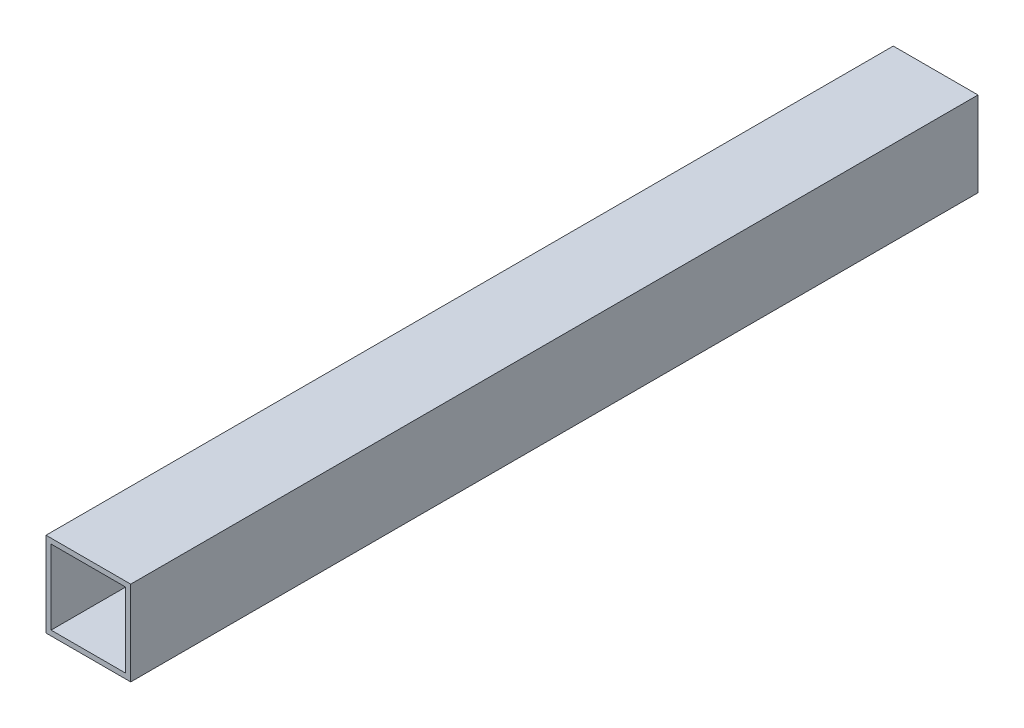
ISO-10303-21;
HEADER;
FILE_DESCRIPTION(('STEP AP214'),'2;1');
FILE_NAME('part.step','',(''),(''),'','','');
FILE_SCHEMA(('AUTOMOTIVE_DESIGN { 1 0 10303 214 1 1 1 1 }'));
ENDSEC;
DATA;
#1=APPLICATION_CONTEXT('core data for automotive mechanical design processes');
#2=APPLICATION_PROTOCOL_DEFINITION('international standard','automotive_design',2000,#1);
#3=PRODUCT_CONTEXT('',#1,'mechanical');
#4=PRODUCT('Part','Part','',(#3));
#5=PRODUCT_RELATED_PRODUCT_CATEGORY('part','',(#4));
#6=PRODUCT_DEFINITION_FORMATION('','',#4);
#7=PRODUCT_DEFINITION_CONTEXT('part definition',#1,'design');
#8=PRODUCT_DEFINITION('design','',#6,#7);
#9=PRODUCT_DEFINITION_SHAPE('','',#8);
#10=(LENGTH_UNIT() NAMED_UNIT(*) SI_UNIT(.MILLI.,.METRE.));
#11=(NAMED_UNIT(*) PLANE_ANGLE_UNIT() SI_UNIT($,.RADIAN.));
#12=(NAMED_UNIT(*) SI_UNIT($,.STERADIAN.) SOLID_ANGLE_UNIT());
#13=UNCERTAINTY_MEASURE_WITH_UNIT(LENGTH_MEASURE(1.E-05),#10,'distance_accuracy_value','');
#14=(GEOMETRIC_REPRESENTATION_CONTEXT(3) GLOBAL_UNCERTAINTY_ASSIGNED_CONTEXT((#13)) GLOBAL_UNIT_ASSIGNED_CONTEXT((#10,
#11,#12)) REPRESENTATION_CONTEXT('',''));
#15=CARTESIAN_POINT('',(0.,0.,0.));
#16=DIRECTION('',(0.,0.,1.));
#17=DIRECTION('',(1.,0.,0.));
#18=AXIS2_PLACEMENT_3D('',#15,#16,#17);
#19=CARTESIAN_POINT('',(0.,0.,250.));
#20=DIRECTION('',(0.,0.,-1.));
#21=DIRECTION('',(-1.,0.,0.));
#22=AXIS2_PLACEMENT_3D('',#19,#20,#21);
#23=PLANE('',#22);
#24=DIRECTION('',(0.,1.,0.));
#25=VECTOR('',#24,1.);
#26=CARTESIAN_POINT('',(25.,-25.,250.));
#27=LINE('',#26,#25);
#28=CARTESIAN_POINT('',(25.,-25.,250.));
#29=VERTEX_POINT('',#28);
#30=CARTESIAN_POINT('',(25.,25.,250.));
#31=VERTEX_POINT('',#30);
#32=EDGE_CURVE('E136',#29,#31,#27,.T.);
#33=ORIENTED_EDGE('',*,*,#32,.T.);
#34=DIRECTION('',(-1.,0.,0.));
#35=VECTOR('',#34,1.);
#36=CARTESIAN_POINT('',(-25.,25.,250.));
#37=LINE('',#36,#35);
#38=CARTESIAN_POINT('',(-25.,25.,250.));
#39=VERTEX_POINT('',#38);
#40=EDGE_CURVE('E139',#31,#39,#37,.T.);
#41=ORIENTED_EDGE('',*,*,#40,.T.);
#42=DIRECTION('',(0.,-1.,0.));
#43=VECTOR('',#42,1.);
#44=CARTESIAN_POINT('',(-25.,-25.,250.));
#45=LINE('',#44,#43);
#46=CARTESIAN_POINT('',(-25.,-25.,250.));
#47=VERTEX_POINT('',#46);
#48=EDGE_CURVE('E142',#39,#47,#45,.T.);
#49=ORIENTED_EDGE('',*,*,#48,.T.);
#50=DIRECTION('',(1.,0.,0.));
#51=VECTOR('',#50,1.);
#52=CARTESIAN_POINT('',(-25.,-25.,250.));
#53=LINE('',#52,#51);
#54=EDGE_CURVE('E144',#47,#29,#53,.T.);
#55=ORIENTED_EDGE('',*,*,#54,.T.);
#56=EDGE_LOOP('',(#33,#41,#49,#55));
#57=FACE_BOUND('',#56,.T.);
#58=DIRECTION('',(1.,0.,0.));
#59=VECTOR('',#58,1.);
#60=CARTESIAN_POINT('',(-22.,-22.,250.));
#61=LINE('',#60,#59);
#62=CARTESIAN_POINT('',(-22.,-22.,250.));
#63=VERTEX_POINT('',#62);
#64=CARTESIAN_POINT('',(22.,-22.,250.));
#65=VERTEX_POINT('',#64);
#66=EDGE_CURVE('E100',#63,#65,#61,.T.);
#67=ORIENTED_EDGE('',*,*,#66,.F.);
#68=DIRECTION('',(0.,-1.,0.));
#69=VECTOR('',#68,1.);
#70=CARTESIAN_POINT('',(-22.,-22.,250.));
#71=LINE('',#70,#69);
#72=CARTESIAN_POINT('',(-22.,22.,250.));
#73=VERTEX_POINT('',#72);
#74=EDGE_CURVE('E122',#73,#63,#71,.T.);
#75=ORIENTED_EDGE('',*,*,#74,.F.);
#76=DIRECTION('',(-1.,0.,0.));
#77=VECTOR('',#76,1.);
#78=CARTESIAN_POINT('',(-22.,22.,250.));
#79=LINE('',#78,#77);
#80=CARTESIAN_POINT('',(22.,22.,250.));
#81=VERTEX_POINT('',#80);
#82=EDGE_CURVE('E120',#81,#73,#79,.T.);
#83=ORIENTED_EDGE('',*,*,#82,.F.);
#84=DIRECTION('',(0.,1.,0.));
#85=VECTOR('',#84,1.);
#86=CARTESIAN_POINT('',(22.,-22.,250.));
#87=LINE('',#86,#85);
#88=EDGE_CURVE('E108',#65,#81,#87,.T.);
#89=ORIENTED_EDGE('',*,*,#88,.F.);
#90=EDGE_LOOP('',(#67,#75,#83,#89));
#91=FACE_BOUND('',#90,.T.);
#92=ADVANCED_FACE('F35',(#57,#91),#23,.F.);
#93=CARTESIAN_POINT('',(0.,0.,-250.));
#94=DIRECTION('',(0.,0.,-1.));
#95=DIRECTION('',(-1.,0.,0.));
#96=AXIS2_PLACEMENT_3D('',#93,#94,#95);
#97=PLANE('',#96);
#98=DIRECTION('',(0.,1.,0.));
#99=VECTOR('',#98,1.);
#100=CARTESIAN_POINT('',(25.,-25.,-250.));
#101=LINE('',#100,#99);
#102=CARTESIAN_POINT('',(25.,-25.,-250.));
#103=VERTEX_POINT('',#102);
#104=CARTESIAN_POINT('',(25.,25.,-250.));
#105=VERTEX_POINT('',#104);
#106=EDGE_CURVE('E116',#103,#105,#101,.T.);
#107=ORIENTED_EDGE('',*,*,#106,.F.);
#108=DIRECTION('',(1.,0.,0.));
#109=VECTOR('',#108,1.);
#110=CARTESIAN_POINT('',(-25.,-25.,-250.));
#111=LINE('',#110,#109);
#112=CARTESIAN_POINT('',(-25.,-25.,-250.));
#113=VERTEX_POINT('',#112);
#114=EDGE_CURVE('E140',#113,#103,#111,.T.);
#115=ORIENTED_EDGE('',*,*,#114,.F.);
#116=DIRECTION('',(0.,-1.,0.));
#117=VECTOR('',#116,1.);
#118=CARTESIAN_POINT('',(-25.,-25.,-250.));
#119=LINE('',#118,#117);
#120=CARTESIAN_POINT('',(-25.,25.,-250.));
#121=VERTEX_POINT('',#120);
#122=EDGE_CURVE('E151',#121,#113,#119,.T.);
#123=ORIENTED_EDGE('',*,*,#122,.F.);
#124=DIRECTION('',(-1.,0.,0.));
#125=VECTOR('',#124,1.);
#126=CARTESIAN_POINT('',(-25.,25.,-250.));
#127=LINE('',#126,#125);
#128=EDGE_CURVE('E149',#105,#121,#127,.T.);
#129=ORIENTED_EDGE('',*,*,#128,.F.);
#130=EDGE_LOOP('',(#107,#115,#123,#129));
#131=FACE_BOUND('',#130,.T.);
#132=DIRECTION('',(0.,-1.,0.));
#133=VECTOR('',#132,1.);
#134=CARTESIAN_POINT('',(-22.,-22.,-250.));
#135=LINE('',#134,#133);
#136=CARTESIAN_POINT('',(-22.,22.,-250.));
#137=VERTEX_POINT('',#136);
#138=CARTESIAN_POINT('',(-22.,-22.,-250.));
#139=VERTEX_POINT('',#138);
#140=EDGE_CURVE('E109',#137,#139,#135,.T.);
#141=ORIENTED_EDGE('',*,*,#140,.T.);
#142=DIRECTION('',(1.,0.,0.));
#143=VECTOR('',#142,1.);
#144=CARTESIAN_POINT('',(-22.,-22.,-250.));
#145=LINE('',#144,#143);
#146=CARTESIAN_POINT('',(22.,-22.,-250.));
#147=VERTEX_POINT('',#146);
#148=EDGE_CURVE('E58',#139,#147,#145,.T.);
#149=ORIENTED_EDGE('',*,*,#148,.T.);
#150=DIRECTION('',(0.,1.,0.));
#151=VECTOR('',#150,1.);
#152=CARTESIAN_POINT('',(22.,-22.,-250.));
#153=LINE('',#152,#151);
#154=CARTESIAN_POINT('',(22.,22.,-250.));
#155=VERTEX_POINT('',#154);
#156=EDGE_CURVE('E115',#147,#155,#153,.T.);
#157=ORIENTED_EDGE('',*,*,#156,.T.);
#158=DIRECTION('',(-1.,0.,0.));
#159=VECTOR('',#158,1.);
#160=CARTESIAN_POINT('',(-22.,22.,-250.));
#161=LINE('',#160,#159);
#162=EDGE_CURVE('E128',#155,#137,#161,.T.);
#163=ORIENTED_EDGE('',*,*,#162,.T.);
#164=EDGE_LOOP('',(#141,#149,#157,#163));
#165=FACE_BOUND('',#164,.T.);
#166=ADVANCED_FACE('F169',(#131,#165),#97,.T.);
#167=CARTESIAN_POINT('',(25.,-25.,250.));
#168=DIRECTION('',(-1.,0.,0.));
#169=DIRECTION('',(0.,0.,1.));
#170=AXIS2_PLACEMENT_3D('',#167,#168,#169);
#171=PLANE('',#170);
#172=ORIENTED_EDGE('',*,*,#106,.T.);
#173=DIRECTION('',(0.,0.,-1.));
#174=VECTOR('',#173,1.);
#175=CARTESIAN_POINT('',(25.,25.,250.));
#176=LINE('',#175,#174);
#177=EDGE_CURVE('E11',#31,#105,#176,.T.);
#178=ORIENTED_EDGE('',*,*,#177,.F.);
#179=ORIENTED_EDGE('',*,*,#32,.F.);
#180=DIRECTION('',(0.,0.,-1.));
#181=VECTOR('',#180,1.);
#182=CARTESIAN_POINT('',(25.,-25.,250.));
#183=LINE('',#182,#181);
#184=EDGE_CURVE('E146',#29,#103,#183,.T.);
#185=ORIENTED_EDGE('',*,*,#184,.T.);
#186=EDGE_LOOP('',(#172,#178,#179,#185));
#187=FACE_BOUND('',#186,.T.);
#188=ADVANCED_FACE('F37',(#187),#171,.F.);
#189=CARTESIAN_POINT('',(-25.,25.,250.));
#190=DIRECTION('',(0.,-1.,0.));
#191=DIRECTION('',(0.,0.,-1.));
#192=AXIS2_PLACEMENT_3D('',#189,#190,#191);
#193=PLANE('',#192);
#194=ORIENTED_EDGE('',*,*,#128,.T.);
#195=DIRECTION('',(0.,0.,-1.));
#196=VECTOR('',#195,1.);
#197=CARTESIAN_POINT('',(-25.,25.,250.));
#198=LINE('',#197,#196);
#199=EDGE_CURVE('E43',#39,#121,#198,.T.);
#200=ORIENTED_EDGE('',*,*,#199,.F.);
#201=ORIENTED_EDGE('',*,*,#40,.F.);
#202=ORIENTED_EDGE('',*,*,#177,.T.);
#203=EDGE_LOOP('',(#194,#200,#201,#202));
#204=FACE_BOUND('',#203,.T.);
#205=ADVANCED_FACE('F179',(#204),#193,.F.);
#206=CARTESIAN_POINT('',(-25.,-25.,250.));
#207=DIRECTION('',(1.,0.,0.));
#208=DIRECTION('',(0.,0.,-1.));
#209=AXIS2_PLACEMENT_3D('',#206,#207,#208);
#210=PLANE('',#209);
#211=ORIENTED_EDGE('',*,*,#122,.T.);
#212=DIRECTION('',(0.,0.,-1.));
#213=VECTOR('',#212,1.);
#214=CARTESIAN_POINT('',(-25.,-25.,250.));
#215=LINE('',#214,#213);
#216=EDGE_CURVE('E156',#47,#113,#215,.T.);
#217=ORIENTED_EDGE('',*,*,#216,.F.);
#218=ORIENTED_EDGE('',*,*,#48,.F.);
#219=ORIENTED_EDGE('',*,*,#199,.T.);
#220=EDGE_LOOP('',(#211,#217,#218,#219));
#221=FACE_BOUND('',#220,.T.);
#222=ADVANCED_FACE('F163',(#221),#210,.F.);
#223=CARTESIAN_POINT('',(-25.,-25.,250.));
#224=DIRECTION('',(0.,1.,0.));
#225=DIRECTION('',(0.,0.,1.));
#226=AXIS2_PLACEMENT_3D('',#223,#224,#225);
#227=PLANE('',#226);
#228=ORIENTED_EDGE('',*,*,#114,.T.);
#229=ORIENTED_EDGE('',*,*,#184,.F.);
#230=ORIENTED_EDGE('',*,*,#54,.F.);
#231=ORIENTED_EDGE('',*,*,#216,.T.);
#232=EDGE_LOOP('',(#228,#229,#230,#231));
#233=FACE_BOUND('',#232,.T.);
#234=ADVANCED_FACE('F173',(#233),#227,.F.);
#235=CARTESIAN_POINT('',(-22.,-22.,250.));
#236=DIRECTION('',(0.,1.,0.));
#237=DIRECTION('',(0.,0.,1.));
#238=AXIS2_PLACEMENT_3D('',#235,#236,#237);
#239=PLANE('',#238);
#240=ORIENTED_EDGE('',*,*,#148,.F.);
#241=DIRECTION('',(0.,0.,-1.));
#242=VECTOR('',#241,1.);
#243=CARTESIAN_POINT('',(-22.,-22.,250.));
#244=LINE('',#243,#242);
#245=EDGE_CURVE('E104',#63,#139,#244,.T.);
#246=ORIENTED_EDGE('',*,*,#245,.F.);
#247=ORIENTED_EDGE('',*,*,#66,.T.);
#248=DIRECTION('',(0.,0.,-1.));
#249=VECTOR('',#248,1.);
#250=CARTESIAN_POINT('',(22.,-22.,250.));
#251=LINE('',#250,#249);
#252=EDGE_CURVE('E103',#65,#147,#251,.T.);
#253=ORIENTED_EDGE('',*,*,#252,.T.);
#254=EDGE_LOOP('',(#240,#246,#247,#253));
#255=FACE_BOUND('',#254,.T.);
#256=ADVANCED_FACE('F102',(#255),#239,.T.);
#257=CARTESIAN_POINT('',(22.,-22.,250.));
#258=DIRECTION('',(-1.,0.,0.));
#259=DIRECTION('',(0.,-1.,0.));
#260=AXIS2_PLACEMENT_3D('',#257,#258,#259);
#261=PLANE('',#260);
#262=ORIENTED_EDGE('',*,*,#156,.F.);
#263=ORIENTED_EDGE('',*,*,#252,.F.);
#264=ORIENTED_EDGE('',*,*,#88,.T.);
#265=DIRECTION('',(0.,0.,-1.));
#266=VECTOR('',#265,1.);
#267=CARTESIAN_POINT('',(22.,22.,250.));
#268=LINE('',#267,#266);
#269=EDGE_CURVE('E117',#81,#155,#268,.T.);
#270=ORIENTED_EDGE('',*,*,#269,.T.);
#271=EDGE_LOOP('',(#262,#263,#264,#270));
#272=FACE_BOUND('',#271,.T.);
#273=ADVANCED_FACE('F112',(#272),#261,.T.);
#274=CARTESIAN_POINT('',(-22.,22.,250.));
#275=DIRECTION('',(0.,-1.,0.));
#276=DIRECTION('',(1.,0.,0.));
#277=AXIS2_PLACEMENT_3D('',#274,#275,#276);
#278=PLANE('',#277);
#279=ORIENTED_EDGE('',*,*,#162,.F.);
#280=ORIENTED_EDGE('',*,*,#269,.F.);
#281=ORIENTED_EDGE('',*,*,#82,.T.);
#282=DIRECTION('',(0.,0.,-1.));
#283=VECTOR('',#282,1.);
#284=CARTESIAN_POINT('',(-22.,22.,250.));
#285=LINE('',#284,#283);
#286=EDGE_CURVE('E50',#73,#137,#285,.T.);
#287=ORIENTED_EDGE('',*,*,#286,.T.);
#288=EDGE_LOOP('',(#279,#280,#281,#287));
#289=FACE_BOUND('',#288,.T.);
#290=ADVANCED_FACE('F202',(#289),#278,.T.);
#291=CARTESIAN_POINT('',(-22.,-22.,250.));
#292=DIRECTION('',(1.,0.,0.));
#293=DIRECTION('',(0.,0.,-1.));
#294=AXIS2_PLACEMENT_3D('',#291,#292,#293);
#295=PLANE('',#294);
#296=ORIENTED_EDGE('',*,*,#140,.F.);
#297=ORIENTED_EDGE('',*,*,#286,.F.);
#298=ORIENTED_EDGE('',*,*,#74,.T.);
#299=ORIENTED_EDGE('',*,*,#245,.T.);
#300=EDGE_LOOP('',(#296,#297,#298,#299));
#301=FACE_BOUND('',#300,.T.);
#302=ADVANCED_FACE('F206',(#301),#295,.T.);
#303=CLOSED_SHELL('',(#92,#166,#188,#205,#222,#234,#256,#273,#290,#302));
#304=MANIFOLD_SOLID_BREP('B2',#303);
#305=ADVANCED_BREP_SHAPE_REPRESENTATION('',(#18,#304),#14);
#306=SHAPE_DEFINITION_REPRESENTATION(#9,#305);
ENDSEC;
END-ISO-10303-21;
